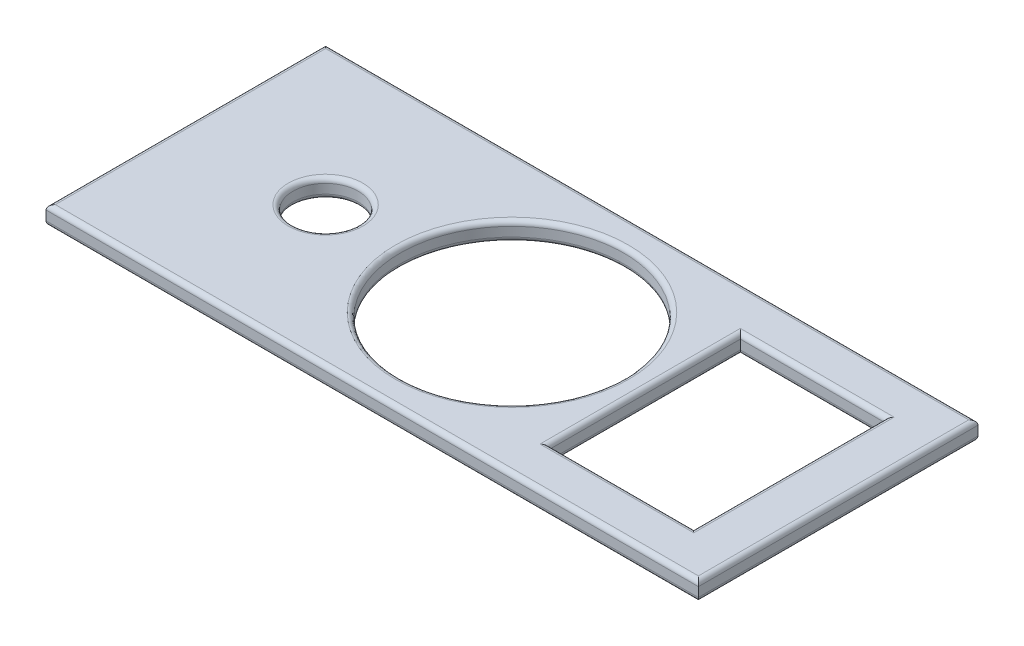
ISO-10303-21;
HEADER;
FILE_DESCRIPTION(('STEP AP214'),'2;1');
FILE_NAME('part.step','',(''),(''),'','','');
FILE_SCHEMA(('AUTOMOTIVE_DESIGN { 1 0 10303 214 1 1 1 1 }'));
ENDSEC;
DATA;
#1=APPLICATION_CONTEXT('core data for automotive mechanical design processes');
#2=APPLICATION_PROTOCOL_DEFINITION('international standard','automotive_design',2000,#1);
#3=PRODUCT_CONTEXT('',#1,'mechanical');
#4=PRODUCT('Part','Part','',(#3));
#5=PRODUCT_RELATED_PRODUCT_CATEGORY('part','',(#4));
#6=PRODUCT_DEFINITION_FORMATION('','',#4);
#7=PRODUCT_DEFINITION_CONTEXT('part definition',#1,'design');
#8=PRODUCT_DEFINITION('design','',#6,#7);
#9=PRODUCT_DEFINITION_SHAPE('','',#8);
#10=(LENGTH_UNIT() NAMED_UNIT(*) SI_UNIT(.MILLI.,.METRE.));
#11=(NAMED_UNIT(*) PLANE_ANGLE_UNIT() SI_UNIT($,.RADIAN.));
#12=(NAMED_UNIT(*) SI_UNIT($,.STERADIAN.) SOLID_ANGLE_UNIT());
#13=UNCERTAINTY_MEASURE_WITH_UNIT(LENGTH_MEASURE(1.E-05),#10,'distance_accuracy_value','');
#14=(GEOMETRIC_REPRESENTATION_CONTEXT(3) GLOBAL_UNCERTAINTY_ASSIGNED_CONTEXT((#13)) GLOBAL_UNIT_ASSIGNED_CONTEXT((#10,
#11,#12)) REPRESENTATION_CONTEXT('',''));
#15=CARTESIAN_POINT('',(0.,0.,0.));
#16=DIRECTION('',(0.,0.,1.));
#17=DIRECTION('',(1.,0.,0.));
#18=AXIS2_PLACEMENT_3D('',#15,#16,#17);
#19=CARTESIAN_POINT('',(0.,2.,0.));
#20=DIRECTION('',(0.,1.,0.));
#21=DIRECTION('',(0.,0.,1.));
#22=AXIS2_PLACEMENT_3D('',#19,#20,#21);
#23=PLANE('',#22);
#24=DIRECTION('',(-1.,0.,0.));
#25=VECTOR('',#24,1.);
#26=CARTESIAN_POINT('',(0.,2.,-10.75));
#27=LINE('',#26,#25);
#28=CARTESIAN_POINT('',(13.75,2.,-10.75));
#29=VERTEX_POINT('',#28);
#30=CARTESIAN_POINT('',(30.25,2.,-10.75));
#31=VERTEX_POINT('',#30);
#32=EDGE_CURVE('E48',#29,#31,#27,.F.);
#33=ORIENTED_EDGE('',*,*,#32,.T.);
#34=DIRECTION('',(0.,0.,-1.));
#35=VECTOR('',#34,1.);
#36=CARTESIAN_POINT('',(30.25,2.,0.));
#37=LINE('',#36,#35);
#38=CARTESIAN_POINT('',(30.25,2.,10.75));
#39=VERTEX_POINT('',#38);
#40=EDGE_CURVE('E11',#31,#39,#37,.F.);
#41=ORIENTED_EDGE('',*,*,#40,.T.);
#42=DIRECTION('',(1.,0.,0.));
#43=VECTOR('',#42,1.);
#44=CARTESIAN_POINT('',(0.,2.,10.75));
#45=LINE('',#44,#43);
#46=CARTESIAN_POINT('',(13.75,2.,10.75));
#47=VERTEX_POINT('',#46);
#48=EDGE_CURVE('E255',#39,#47,#45,.F.);
#49=ORIENTED_EDGE('',*,*,#48,.T.);
#50=DIRECTION('',(0.,0.,1.));
#51=VECTOR('',#50,1.);
#52=CARTESIAN_POINT('',(13.75,2.,0.));
#53=LINE('',#52,#51);
#54=EDGE_CURVE('E56',#47,#29,#53,.F.);
#55=ORIENTED_EDGE('',*,*,#54,.T.);
#56=EDGE_LOOP('',(#33,#41,#49,#55));
#57=FACE_BOUND('',#56,.T.);
#58=CARTESIAN_POINT('',(-20.,2.,0.));
#59=DIRECTION('',(0.,1.,0.));
#60=DIRECTION('',(0.,0.,1.));
#61=AXIS2_PLACEMENT_3D('',#58,#59,#60);
#62=CIRCLE('',#61,4.);
#63=CARTESIAN_POINT('',(-20.,2.,4.00000000000001));
#64=VERTEX_POINT('',#63);
#65=EDGE_CURVE('E253',#64,#64,#62,.F.);
#66=ORIENTED_EDGE('',*,*,#65,.T.);
#67=EDGE_LOOP('',(#66));
#68=FACE_BOUND('',#67,.T.);
#69=DIRECTION('',(0.,0.,-1.));
#70=VECTOR('',#69,1.);
#71=CARTESIAN_POINT('',(34.5,2.,-15.));
#72=LINE('',#71,#70);
#73=CARTESIAN_POINT('',(34.5,2.,14.5));
#74=VERTEX_POINT('',#73);
#75=CARTESIAN_POINT('',(34.5,2.,-14.5));
#76=VERTEX_POINT('',#75);
#77=EDGE_CURVE('E247',#74,#76,#72,.T.);
#78=ORIENTED_EDGE('',*,*,#77,.T.);
#79=DIRECTION('',(-1.,0.,0.));
#80=VECTOR('',#79,1.);
#81=CARTESIAN_POINT('',(-35.,2.,-14.5));
#82=LINE('',#81,#80);
#83=CARTESIAN_POINT('',(-34.5,2.,-14.5));
#84=VERTEX_POINT('',#83);
#85=EDGE_CURVE('E249',#76,#84,#82,.T.);
#86=ORIENTED_EDGE('',*,*,#85,.T.);
#87=DIRECTION('',(0.,0.,1.));
#88=VECTOR('',#87,1.);
#89=CARTESIAN_POINT('',(-34.5,2.,15.));
#90=LINE('',#89,#88);
#91=CARTESIAN_POINT('',(-34.5,2.,14.5));
#92=VERTEX_POINT('',#91);
#93=EDGE_CURVE('E245',#84,#92,#90,.T.);
#94=ORIENTED_EDGE('',*,*,#93,.T.);
#95=DIRECTION('',(1.,0.,0.));
#96=VECTOR('',#95,1.);
#97=CARTESIAN_POINT('',(35.,2.,14.5));
#98=LINE('',#97,#96);
#99=EDGE_CURVE('E243',#92,#74,#98,.T.);
#100=ORIENTED_EDGE('',*,*,#99,.T.);
#101=EDGE_LOOP('',(#78,#86,#94,#100));
#102=FACE_BOUND('',#101,.T.);
#103=CARTESIAN_POINT('',(0.,2.,0.));
#104=DIRECTION('',(0.,1.,0.));
#105=DIRECTION('',(0.,0.,1.));
#106=AXIS2_PLACEMENT_3D('',#103,#104,#105);
#107=CIRCLE('',#106,12.5);
#108=CARTESIAN_POINT('',(0.,2.,12.5));
#109=VERTEX_POINT('',#108);
#110=EDGE_CURVE('E239',#109,#109,#107,.F.);
#111=ORIENTED_EDGE('',*,*,#110,.T.);
#112=EDGE_LOOP('',(#111));
#113=FACE_BOUND('',#112,.T.);
#114=ADVANCED_FACE('F39',(#57,#68,#102,#113),#23,.T.);
#115=CARTESIAN_POINT('',(0.,0.,0.));
#116=DIRECTION('',(0.,1.,0.));
#117=DIRECTION('',(0.,0.,1.));
#118=AXIS2_PLACEMENT_3D('',#115,#116,#117);
#119=PLANE('',#118);
#120=DIRECTION('',(0.,0.,-1.));
#121=VECTOR('',#120,1.);
#122=CARTESIAN_POINT('',(30.25,0.,-10.25));
#123=LINE('',#122,#121);
#124=CARTESIAN_POINT('',(30.25,0.,10.75));
#125=VERTEX_POINT('',#124);
#126=CARTESIAN_POINT('',(30.25,0.,-10.75));
#127=VERTEX_POINT('',#126);
#128=EDGE_CURVE('E187',#125,#127,#123,.T.);
#129=ORIENTED_EDGE('',*,*,#128,.T.);
#130=DIRECTION('',(-1.,0.,0.));
#131=VECTOR('',#130,1.);
#132=CARTESIAN_POINT('',(14.25,0.,-10.75));
#133=LINE('',#132,#131);
#134=CARTESIAN_POINT('',(13.75,0.,-10.75));
#135=VERTEX_POINT('',#134);
#136=EDGE_CURVE('E189',#127,#135,#133,.T.);
#137=ORIENTED_EDGE('',*,*,#136,.T.);
#138=DIRECTION('',(0.,0.,1.));
#139=VECTOR('',#138,1.);
#140=CARTESIAN_POINT('',(13.75,0.,10.25));
#141=LINE('',#140,#139);
#142=CARTESIAN_POINT('',(13.75,0.,10.75));
#143=VERTEX_POINT('',#142);
#144=EDGE_CURVE('E178',#135,#143,#141,.T.);
#145=ORIENTED_EDGE('',*,*,#144,.T.);
#146=DIRECTION('',(1.,0.,0.));
#147=VECTOR('',#146,1.);
#148=CARTESIAN_POINT('',(29.75,0.,10.75));
#149=LINE('',#148,#147);
#150=EDGE_CURVE('E185',#143,#125,#149,.T.);
#151=ORIENTED_EDGE('',*,*,#150,.T.);
#152=EDGE_LOOP('',(#129,#137,#145,#151));
#153=FACE_BOUND('',#152,.T.);
#154=DIRECTION('',(0.,0.,-1.));
#155=VECTOR('',#154,1.);
#156=CARTESIAN_POINT('',(34.5,0.,0.));
#157=LINE('',#156,#155);
#158=CARTESIAN_POINT('',(34.5,0.,-14.5));
#159=VERTEX_POINT('',#158);
#160=CARTESIAN_POINT('',(34.5,0.,14.5));
#161=VERTEX_POINT('',#160);
#162=EDGE_CURVE('E176',#159,#161,#157,.F.);
#163=ORIENTED_EDGE('',*,*,#162,.T.);
#164=DIRECTION('',(1.,0.,0.));
#165=VECTOR('',#164,1.);
#166=CARTESIAN_POINT('',(0.,0.,14.5));
#167=LINE('',#166,#165);
#168=CARTESIAN_POINT('',(-34.5,0.,14.5));
#169=VERTEX_POINT('',#168);
#170=EDGE_CURVE('E160',#161,#169,#167,.F.);
#171=ORIENTED_EDGE('',*,*,#170,.T.);
#172=DIRECTION('',(0.,0.,1.));
#173=VECTOR('',#172,1.);
#174=CARTESIAN_POINT('',(-34.5,0.,0.));
#175=LINE('',#174,#173);
#176=CARTESIAN_POINT('',(-34.5,0.,-14.5));
#177=VERTEX_POINT('',#176);
#178=EDGE_CURVE('E170',#169,#177,#175,.F.);
#179=ORIENTED_EDGE('',*,*,#178,.T.);
#180=DIRECTION('',(-1.,0.,0.));
#181=VECTOR('',#180,1.);
#182=CARTESIAN_POINT('',(0.,0.,-14.5));
#183=LINE('',#182,#181);
#184=EDGE_CURVE('E172',#177,#159,#183,.F.);
#185=ORIENTED_EDGE('',*,*,#184,.T.);
#186=EDGE_LOOP('',(#163,#171,#179,#185));
#187=FACE_BOUND('',#186,.T.);
#188=CARTESIAN_POINT('',(0.,0.,0.));
#189=DIRECTION('',(0.,1.,0.));
#190=DIRECTION('',(0.,0.,1.));
#191=AXIS2_PLACEMENT_3D('',#188,#189,#190);
#192=CIRCLE('',#191,12.5);
#193=CARTESIAN_POINT('',(0.,0.,12.5));
#194=VERTEX_POINT('',#193);
#195=EDGE_CURVE('E173',#194,#194,#192,.T.);
#196=ORIENTED_EDGE('',*,*,#195,.T.);
#197=EDGE_LOOP('',(#196));
#198=FACE_BOUND('',#197,.T.);
#199=CARTESIAN_POINT('',(-20.,0.,0.));
#200=DIRECTION('',(0.,1.,0.));
#201=DIRECTION('',(0.,0.,1.));
#202=AXIS2_PLACEMENT_3D('',#199,#200,#201);
#203=CIRCLE('',#202,4.);
#204=CARTESIAN_POINT('',(-20.,0.,4.00000000000001));
#205=VERTEX_POINT('',#204);
#206=EDGE_CURVE('E312',#205,#205,#203,.T.);
#207=ORIENTED_EDGE('',*,*,#206,.T.);
#208=EDGE_LOOP('',(#207));
#209=FACE_BOUND('',#208,.T.);
#210=ADVANCED_FACE('F177',(#153,#187,#198,#209),#119,.F.);
#211=CARTESIAN_POINT('',(-35.,2.,15.));
#212=DIRECTION('',(1.,0.,0.));
#213=DIRECTION('',(0.,0.,-1.));
#214=AXIS2_PLACEMENT_3D('',#211,#212,#213);
#215=PLANE('',#214);
#216=DIRECTION('',(0.,-1.,0.));
#217=VECTOR('',#216,1.);
#218=CARTESIAN_POINT('',(-35.,2.,-15.));
#219=LINE('',#218,#217);
#220=CARTESIAN_POINT('',(-35.,1.5,-15.));
#221=VERTEX_POINT('',#220);
#222=CARTESIAN_POINT('',(-35.,0.5,-15.));
#223=VERTEX_POINT('',#222);
#224=EDGE_CURVE('E336',#221,#223,#219,.T.);
#225=ORIENTED_EDGE('',*,*,#224,.T.);
#226=DIRECTION('',(0.,0.,1.));
#227=VECTOR('',#226,1.);
#228=CARTESIAN_POINT('',(-35.,0.5,15.));
#229=LINE('',#228,#227);
#230=CARTESIAN_POINT('',(-35.,0.5,15.));
#231=VERTEX_POINT('',#230);
#232=EDGE_CURVE('E223',#223,#231,#229,.T.);
#233=ORIENTED_EDGE('',*,*,#232,.T.);
#234=DIRECTION('',(0.,-1.,0.));
#235=VECTOR('',#234,1.);
#236=CARTESIAN_POINT('',(-35.,2.,15.));
#237=LINE('',#236,#235);
#238=CARTESIAN_POINT('',(-35.,1.5,15.));
#239=VERTEX_POINT('',#238);
#240=EDGE_CURVE('E306',#239,#231,#237,.T.);
#241=ORIENTED_EDGE('',*,*,#240,.F.);
#242=DIRECTION('',(0.,0.,1.));
#243=VECTOR('',#242,1.);
#244=CARTESIAN_POINT('',(-35.,1.5,-15.));
#245=LINE('',#244,#243);
#246=EDGE_CURVE('E224',#239,#221,#245,.F.);
#247=ORIENTED_EDGE('',*,*,#246,.T.);
#248=EDGE_LOOP('',(#225,#233,#241,#247));
#249=FACE_BOUND('',#248,.T.);
#250=ADVANCED_FACE('F311',(#249),#215,.F.);
#251=CARTESIAN_POINT('',(35.,2.,15.));
#252=DIRECTION('',(0.,0.,-1.));
#253=DIRECTION('',(-1.,0.,0.));
#254=AXIS2_PLACEMENT_3D('',#251,#252,#253);
#255=PLANE('',#254);
#256=ORIENTED_EDGE('',*,*,#240,.T.);
#257=DIRECTION('',(1.,0.,0.));
#258=VECTOR('',#257,1.);
#259=CARTESIAN_POINT('',(35.,0.5,15.));
#260=LINE('',#259,#258);
#261=CARTESIAN_POINT('',(35.,0.5,15.));
#262=VERTEX_POINT('',#261);
#263=EDGE_CURVE('E159',#231,#262,#260,.T.);
#264=ORIENTED_EDGE('',*,*,#263,.T.);
#265=DIRECTION('',(0.,-1.,0.));
#266=VECTOR('',#265,1.);
#267=CARTESIAN_POINT('',(35.,2.,15.));
#268=LINE('',#267,#266);
#269=CARTESIAN_POINT('',(35.,1.5,15.));
#270=VERTEX_POINT('',#269);
#271=EDGE_CURVE('E309',#270,#262,#268,.T.);
#272=ORIENTED_EDGE('',*,*,#271,.F.);
#273=DIRECTION('',(1.,0.,0.));
#274=VECTOR('',#273,1.);
#275=CARTESIAN_POINT('',(-35.,1.5,15.));
#276=LINE('',#275,#274);
#277=EDGE_CURVE('E211',#270,#239,#276,.F.);
#278=ORIENTED_EDGE('',*,*,#277,.T.);
#279=EDGE_LOOP('',(#256,#264,#272,#278));
#280=FACE_BOUND('',#279,.T.);
#281=ADVANCED_FACE('F307',(#280),#255,.F.);
#282=CARTESIAN_POINT('',(35.,2.,15.));
#283=DIRECTION('',(-1.,0.,0.));
#284=DIRECTION('',(0.,0.,1.));
#285=AXIS2_PLACEMENT_3D('',#282,#283,#284);
#286=PLANE('',#285);
#287=ORIENTED_EDGE('',*,*,#271,.T.);
#288=DIRECTION('',(0.,0.,-1.));
#289=VECTOR('',#288,1.);
#290=CARTESIAN_POINT('',(35.,0.5,15.));
#291=LINE('',#290,#289);
#292=CARTESIAN_POINT('',(35.,0.5,-15.));
#293=VERTEX_POINT('',#292);
#294=EDGE_CURVE('E216',#262,#293,#291,.T.);
#295=ORIENTED_EDGE('',*,*,#294,.T.);
#296=DIRECTION('',(0.,-1.,0.));
#297=VECTOR('',#296,1.);
#298=CARTESIAN_POINT('',(35.,2.,-15.));
#299=LINE('',#298,#297);
#300=CARTESIAN_POINT('',(35.,1.5,-15.));
#301=VERTEX_POINT('',#300);
#302=EDGE_CURVE('E317',#301,#293,#299,.T.);
#303=ORIENTED_EDGE('',*,*,#302,.F.);
#304=DIRECTION('',(0.,0.,-1.));
#305=VECTOR('',#304,1.);
#306=CARTESIAN_POINT('',(35.,1.5,15.));
#307=LINE('',#306,#305);
#308=EDGE_CURVE('E212',#301,#270,#307,.F.);
#309=ORIENTED_EDGE('',*,*,#308,.T.);
#310=EDGE_LOOP('',(#287,#295,#303,#309));
#311=FACE_BOUND('',#310,.T.);
#312=ADVANCED_FACE('F331',(#311),#286,.F.);
#313=CARTESIAN_POINT('',(35.,2.,-15.));
#314=DIRECTION('',(0.,0.,1.));
#315=DIRECTION('',(1.,0.,0.));
#316=AXIS2_PLACEMENT_3D('',#313,#314,#315);
#317=PLANE('',#316);
#318=ORIENTED_EDGE('',*,*,#302,.T.);
#319=DIRECTION('',(-1.,0.,0.));
#320=VECTOR('',#319,1.);
#321=CARTESIAN_POINT('',(35.,0.5,-15.));
#322=LINE('',#321,#320);
#323=EDGE_CURVE('E222',#293,#223,#322,.T.);
#324=ORIENTED_EDGE('',*,*,#323,.T.);
#325=ORIENTED_EDGE('',*,*,#224,.F.);
#326=DIRECTION('',(-1.,0.,0.));
#327=VECTOR('',#326,1.);
#328=CARTESIAN_POINT('',(35.,1.5,-15.));
#329=LINE('',#328,#327);
#330=EDGE_CURVE('E217',#221,#301,#329,.F.);
#331=ORIENTED_EDGE('',*,*,#330,.T.);
#332=EDGE_LOOP('',(#318,#324,#325,#331));
#333=FACE_BOUND('',#332,.T.);
#334=ADVANCED_FACE('F403',(#333),#317,.F.);
#335=CARTESIAN_POINT('',(0.,2.,0.));
#336=DIRECTION('',(0.,-1.,0.));
#337=DIRECTION('',(0.,0.,-1.));
#338=AXIS2_PLACEMENT_3D('',#335,#336,#337);
#339=CYLINDRICAL_SURFACE('',#338,12.);
#340=CARTESIAN_POINT('',(0.,0.5,0.));
#341=DIRECTION('',(0.,1.,0.));
#342=DIRECTION('',(0.,0.,1.));
#343=AXIS2_PLACEMENT_3D('',#340,#341,#342);
#344=CIRCLE('',#343,12.);
#345=CARTESIAN_POINT('',(0.,0.5,12.));
#346=VERTEX_POINT('',#345);
#347=EDGE_CURVE('E229',#346,#346,#344,.F.);
#348=ORIENTED_EDGE('',*,*,#347,.T.);
#349=EDGE_LOOP('',(#348));
#350=FACE_BOUND('',#349,.T.);
#351=CARTESIAN_POINT('',(0.,1.5,0.));
#352=DIRECTION('',(0.,1.,0.));
#353=DIRECTION('',(0.,0.,1.));
#354=AXIS2_PLACEMENT_3D('',#351,#352,#353);
#355=CIRCLE('',#354,12.);
#356=CARTESIAN_POINT('',(0.,1.5,12.));
#357=VERTEX_POINT('',#356);
#358=EDGE_CURVE('E230',#357,#357,#355,.T.);
#359=ORIENTED_EDGE('',*,*,#358,.T.);
#360=EDGE_LOOP('',(#359));
#361=FACE_BOUND('',#360,.T.);
#362=ADVANCED_FACE('F405',(#350,#361),#339,.F.);
#363=CARTESIAN_POINT('',(-20.,2.,0.));
#364=DIRECTION('',(0.,-1.,0.));
#365=DIRECTION('',(0.,0.,-1.));
#366=AXIS2_PLACEMENT_3D('',#363,#364,#365);
#367=CYLINDRICAL_SURFACE('',#366,3.5);
#368=CARTESIAN_POINT('',(-20.,0.5,0.));
#369=DIRECTION('',(0.,1.,0.));
#370=DIRECTION('',(0.,0.,1.));
#371=AXIS2_PLACEMENT_3D('',#368,#369,#370);
#372=CIRCLE('',#371,3.5);
#373=CARTESIAN_POINT('',(-20.,0.5,3.50000000000001));
#374=VERTEX_POINT('',#373);
#375=EDGE_CURVE('E237',#374,#374,#372,.F.);
#376=ORIENTED_EDGE('',*,*,#375,.T.);
#377=EDGE_LOOP('',(#376));
#378=FACE_BOUND('',#377,.T.);
#379=CARTESIAN_POINT('',(-20.,1.5,0.));
#380=DIRECTION('',(0.,1.,0.));
#381=DIRECTION('',(0.,0.,1.));
#382=AXIS2_PLACEMENT_3D('',#379,#380,#381);
#383=CIRCLE('',#382,3.5);
#384=CARTESIAN_POINT('',(-20.,1.5,3.50000000000001));
#385=VERTEX_POINT('',#384);
#386=EDGE_CURVE('E234',#385,#385,#383,.T.);
#387=ORIENTED_EDGE('',*,*,#386,.T.);
#388=EDGE_LOOP('',(#387));
#389=FACE_BOUND('',#388,.T.);
#390=ADVANCED_FACE('F610',(#378,#389),#367,.F.);
#391=CARTESIAN_POINT('',(14.25,2.,10.25));
#392=DIRECTION('',(1.,0.,0.));
#393=DIRECTION('',(0.,0.,-1.));
#394=AXIS2_PLACEMENT_3D('',#391,#392,#393);
#395=PLANE('',#394);
#396=DIRECTION('',(0.,-1.,0.));
#397=VECTOR('',#396,1.);
#398=CARTESIAN_POINT('',(14.25,2.,10.25));
#399=LINE('',#398,#397);
#400=CARTESIAN_POINT('',(14.25,1.5,10.25));
#401=VERTEX_POINT('',#400);
#402=CARTESIAN_POINT('',(14.25,0.5,10.25));
#403=VERTEX_POINT('',#402);
#404=EDGE_CURVE('E340',#401,#403,#399,.T.);
#405=ORIENTED_EDGE('',*,*,#404,.T.);
#406=DIRECTION('',(0.,0.,1.));
#407=VECTOR('',#406,1.);
#408=CARTESIAN_POINT('',(14.25,0.5,-10.25));
#409=LINE('',#408,#407);
#410=CARTESIAN_POINT('',(14.25,0.5,-10.25));
#411=VERTEX_POINT('',#410);
#412=EDGE_CURVE('E207',#403,#411,#409,.F.);
#413=ORIENTED_EDGE('',*,*,#412,.T.);
#414=DIRECTION('',(0.,-1.,0.));
#415=VECTOR('',#414,1.);
#416=CARTESIAN_POINT('',(14.25,2.,-10.25));
#417=LINE('',#416,#415);
#418=CARTESIAN_POINT('',(14.25,1.5,-10.25));
#419=VERTEX_POINT('',#418);
#420=EDGE_CURVE('E268',#419,#411,#417,.T.);
#421=ORIENTED_EDGE('',*,*,#420,.F.);
#422=DIRECTION('',(0.,0.,1.));
#423=VECTOR('',#422,1.);
#424=CARTESIAN_POINT('',(14.25,1.5,10.25));
#425=LINE('',#424,#423);
#426=EDGE_CURVE('E210',#419,#401,#425,.T.);
#427=ORIENTED_EDGE('',*,*,#426,.T.);
#428=EDGE_LOOP('',(#405,#413,#421,#427));
#429=FACE_BOUND('',#428,.T.);
#430=ADVANCED_FACE('F597',(#429),#395,.T.);
#431=CARTESIAN_POINT('',(29.75,2.,10.25));
#432=DIRECTION('',(0.,0.,-1.));
#433=DIRECTION('',(-1.,0.,0.));
#434=AXIS2_PLACEMENT_3D('',#431,#432,#433);
#435=PLANE('',#434);
#436=DIRECTION('',(0.,-1.,0.));
#437=VECTOR('',#436,1.);
#438=CARTESIAN_POINT('',(29.75,2.,10.25));
#439=LINE('',#438,#437);
#440=CARTESIAN_POINT('',(29.75,1.5,10.25));
#441=VERTEX_POINT('',#440);
#442=CARTESIAN_POINT('',(29.75,0.5,10.25));
#443=VERTEX_POINT('',#442);
#444=EDGE_CURVE('E345',#441,#443,#439,.T.);
#445=ORIENTED_EDGE('',*,*,#444,.T.);
#446=DIRECTION('',(1.,0.,0.));
#447=VECTOR('',#446,1.);
#448=CARTESIAN_POINT('',(14.25,0.5,10.25));
#449=LINE('',#448,#447);
#450=EDGE_CURVE('E202',#443,#403,#449,.F.);
#451=ORIENTED_EDGE('',*,*,#450,.T.);
#452=ORIENTED_EDGE('',*,*,#404,.F.);
#453=DIRECTION('',(1.,0.,0.));
#454=VECTOR('',#453,1.);
#455=CARTESIAN_POINT('',(29.75,1.5,10.25));
#456=LINE('',#455,#454);
#457=EDGE_CURVE('E201',#401,#441,#456,.T.);
#458=ORIENTED_EDGE('',*,*,#457,.T.);
#459=EDGE_LOOP('',(#445,#451,#452,#458));
#460=FACE_BOUND('',#459,.T.);
#461=ADVANCED_FACE('F379',(#460),#435,.T.);
#462=CARTESIAN_POINT('',(29.75,2.,10.25));
#463=DIRECTION('',(-1.,0.,0.));
#464=DIRECTION('',(0.,0.,1.));
#465=AXIS2_PLACEMENT_3D('',#462,#463,#464);
#466=PLANE('',#465);
#467=DIRECTION('',(0.,-1.,0.));
#468=VECTOR('',#467,1.);
#469=CARTESIAN_POINT('',(29.75,2.,-10.25));
#470=LINE('',#469,#468);
#471=CARTESIAN_POINT('',(29.75,1.5,-10.25));
#472=VERTEX_POINT('',#471);
#473=CARTESIAN_POINT('',(29.75,0.5,-10.25));
#474=VERTEX_POINT('',#473);
#475=EDGE_CURVE('E343',#472,#474,#470,.T.);
#476=ORIENTED_EDGE('',*,*,#475,.T.);
#477=DIRECTION('',(0.,0.,-1.));
#478=VECTOR('',#477,1.);
#479=CARTESIAN_POINT('',(29.75,0.5,10.25));
#480=LINE('',#479,#478);
#481=EDGE_CURVE('E203',#474,#443,#480,.F.);
#482=ORIENTED_EDGE('',*,*,#481,.T.);
#483=ORIENTED_EDGE('',*,*,#444,.F.);
#484=DIRECTION('',(0.,0.,-1.));
#485=VECTOR('',#484,1.);
#486=CARTESIAN_POINT('',(29.75,1.5,10.25));
#487=LINE('',#486,#485);
#488=EDGE_CURVE('E196',#441,#472,#487,.T.);
#489=ORIENTED_EDGE('',*,*,#488,.T.);
#490=EDGE_LOOP('',(#476,#482,#483,#489));
#491=FACE_BOUND('',#490,.T.);
#492=ADVANCED_FACE('F376',(#491),#466,.T.);
#493=CARTESIAN_POINT('',(29.75,2.,-10.25));
#494=DIRECTION('',(0.,0.,1.));
#495=DIRECTION('',(1.,0.,0.));
#496=AXIS2_PLACEMENT_3D('',#493,#494,#495);
#497=PLANE('',#496);
#498=ORIENTED_EDGE('',*,*,#420,.T.);
#499=DIRECTION('',(-1.,0.,0.));
#500=VECTOR('',#499,1.);
#501=CARTESIAN_POINT('',(29.75,0.5,-10.25));
#502=LINE('',#501,#500);
#503=EDGE_CURVE('E193',#411,#474,#502,.F.);
#504=ORIENTED_EDGE('',*,*,#503,.T.);
#505=ORIENTED_EDGE('',*,*,#475,.F.);
#506=DIRECTION('',(-1.,0.,0.));
#507=VECTOR('',#506,1.);
#508=CARTESIAN_POINT('',(29.75,1.5,-10.25));
#509=LINE('',#508,#507);
#510=EDGE_CURVE('E194',#472,#419,#509,.T.);
#511=ORIENTED_EDGE('',*,*,#510,.T.);
#512=EDGE_LOOP('',(#498,#504,#505,#511));
#513=FACE_BOUND('',#512,.T.);
#514=ADVANCED_FACE('F355',(#513),#497,.T.);
#515=CARTESIAN_POINT('',(0.,0.5,10.75));
#516=DIRECTION('',(-1.,0.,0.));
#517=DIRECTION('',(0.,0.,1.));
#518=AXIS2_PLACEMENT_3D('',#515,#516,#517);
#519=CYLINDRICAL_SURFACE('',#518,0.5);
#520=CARTESIAN_POINT('',(13.75,0.5,10.75));
#521=DIRECTION('',(-0.707106781186548,0.,-0.707106781186547));
#522=DIRECTION('',(-0.707106781186547,0.,0.707106781186548));
#523=AXIS2_PLACEMENT_3D('',#520,#521,#522);
#524=ELLIPSE('',#523,0.707106781186547,0.5);
#525=EDGE_CURVE('E265',#403,#143,#524,.T.);
#526=ORIENTED_EDGE('',*,*,#525,.F.);
#527=ORIENTED_EDGE('',*,*,#450,.F.);
#528=CARTESIAN_POINT('',(30.25,0.5,10.75));
#529=DIRECTION('',(-0.707106781186547,0.,0.707106781186548));
#530=DIRECTION('',(0.707106781186548,0.,0.707106781186547));
#531=AXIS2_PLACEMENT_3D('',#528,#529,#530);
#532=ELLIPSE('',#531,0.707106781186547,0.5);
#533=EDGE_CURVE('E264',#125,#443,#532,.F.);
#534=ORIENTED_EDGE('',*,*,#533,.F.);
#535=ORIENTED_EDGE('',*,*,#150,.F.);
#536=EDGE_LOOP('',(#526,#527,#534,#535));
#537=FACE_BOUND('',#536,.T.);
#538=ADVANCED_FACE('F383',(#537),#519,.T.);
#539=CARTESIAN_POINT('',(30.25,0.5,0.));
#540=DIRECTION('',(0.,0.,1.));
#541=DIRECTION('',(1.,0.,0.));
#542=AXIS2_PLACEMENT_3D('',#539,#540,#541);
#543=CYLINDRICAL_SURFACE('',#542,0.5);
#544=ORIENTED_EDGE('',*,*,#533,.T.);
#545=ORIENTED_EDGE('',*,*,#481,.F.);
#546=CARTESIAN_POINT('',(30.25,0.5,-10.75));
#547=DIRECTION('',(0.707106781186548,0.,0.707106781186547));
#548=DIRECTION('',(0.707106781186547,0.,-0.707106781186548));
#549=AXIS2_PLACEMENT_3D('',#546,#547,#548);
#550=ELLIPSE('',#549,0.707106781186548,0.5);
#551=EDGE_CURVE('E257',#127,#474,#550,.F.);
#552=ORIENTED_EDGE('',*,*,#551,.F.);
#553=ORIENTED_EDGE('',*,*,#128,.F.);
#554=EDGE_LOOP('',(#544,#545,#552,#553));
#555=FACE_BOUND('',#554,.T.);
#556=ADVANCED_FACE('F373',(#555),#543,.T.);
#557=CARTESIAN_POINT('',(13.75,0.5,0.));
#558=DIRECTION('',(0.,0.,-1.));
#559=DIRECTION('',(-1.,0.,0.));
#560=AXIS2_PLACEMENT_3D('',#557,#558,#559);
#561=CYLINDRICAL_SURFACE('',#560,0.5);
#562=ORIENTED_EDGE('',*,*,#525,.T.);
#563=ORIENTED_EDGE('',*,*,#144,.F.);
#564=CARTESIAN_POINT('',(13.75,0.5,-10.75));
#565=DIRECTION('',(0.707106781186547,0.,-0.707106781186548));
#566=DIRECTION('',(0.707106781186548,0.,0.707106781186547));
#567=AXIS2_PLACEMENT_3D('',#564,#565,#566);
#568=ELLIPSE('',#567,0.707106781186548,0.5);
#569=EDGE_CURVE('E256',#411,#135,#568,.T.);
#570=ORIENTED_EDGE('',*,*,#569,.F.);
#571=ORIENTED_EDGE('',*,*,#412,.F.);
#572=EDGE_LOOP('',(#562,#563,#570,#571));
#573=FACE_BOUND('',#572,.T.);
#574=ADVANCED_FACE('F368',(#573),#561,.T.);
#575=CARTESIAN_POINT('',(0.,0.5,-10.75));
#576=DIRECTION('',(1.,0.,0.));
#577=DIRECTION('',(0.,0.,-1.));
#578=AXIS2_PLACEMENT_3D('',#575,#576,#577);
#579=CYLINDRICAL_SURFACE('',#578,0.5);
#580=ORIENTED_EDGE('',*,*,#551,.T.);
#581=ORIENTED_EDGE('',*,*,#503,.F.);
#582=ORIENTED_EDGE('',*,*,#569,.T.);
#583=ORIENTED_EDGE('',*,*,#136,.F.);
#584=EDGE_LOOP('',(#580,#581,#582,#583));
#585=FACE_BOUND('',#584,.T.);
#586=ADVANCED_FACE('F356',(#585),#579,.T.);
#587=CARTESIAN_POINT('',(35.,0.5,-14.5));
#588=DIRECTION('',(-1.,0.,0.));
#589=DIRECTION('',(0.,0.,1.));
#590=AXIS2_PLACEMENT_3D('',#587,#588,#589);
#591=CYLINDRICAL_SURFACE('',#590,0.5);
#592=CARTESIAN_POINT('',(34.5,0.5,-14.5));
#593=DIRECTION('',(-0.707106781186547,0.,-0.707106781186547));
#594=DIRECTION('',(-0.707106781186547,0.,0.707106781186547));
#595=AXIS2_PLACEMENT_3D('',#592,#593,#594);
#596=ELLIPSE('',#595,0.707106781186547,0.5);
#597=EDGE_CURVE('E162',#159,#293,#596,.F.);
#598=ORIENTED_EDGE('',*,*,#597,.F.);
#599=ORIENTED_EDGE('',*,*,#184,.F.);
#600=CARTESIAN_POINT('',(-34.5,0.5,-14.5));
#601=DIRECTION('',(-0.707106781186547,0.,0.707106781186547));
#602=DIRECTION('',(0.707106781186547,0.,0.707106781186547));
#603=AXIS2_PLACEMENT_3D('',#600,#601,#602);
#604=ELLIPSE('',#603,0.707106781186547,0.5);
#605=EDGE_CURVE('E168',#223,#177,#604,.T.);
#606=ORIENTED_EDGE('',*,*,#605,.F.);
#607=ORIENTED_EDGE('',*,*,#323,.F.);
#608=EDGE_LOOP('',(#598,#599,#606,#607));
#609=FACE_BOUND('',#608,.T.);
#610=ADVANCED_FACE('F330',(#609),#591,.T.);
#611=CARTESIAN_POINT('',(-34.5,0.5,15.));
#612=DIRECTION('',(0.,0.,1.));
#613=DIRECTION('',(1.,0.,0.));
#614=AXIS2_PLACEMENT_3D('',#611,#612,#613);
#615=CYLINDRICAL_SURFACE('',#614,0.5);
#616=ORIENTED_EDGE('',*,*,#605,.T.);
#617=ORIENTED_EDGE('',*,*,#178,.F.);
#618=CARTESIAN_POINT('',(-34.5,0.5,14.5));
#619=DIRECTION('',(0.707106781186547,0.,0.707106781186547));
#620=DIRECTION('',(-0.707106781186547,0.,0.707106781186547));
#621=AXIS2_PLACEMENT_3D('',#618,#619,#620);
#622=ELLIPSE('',#621,0.707106781186547,0.5);
#623=EDGE_CURVE('E153',#231,#169,#622,.T.);
#624=ORIENTED_EDGE('',*,*,#623,.F.);
#625=ORIENTED_EDGE('',*,*,#232,.F.);
#626=EDGE_LOOP('',(#616,#617,#624,#625));
#627=FACE_BOUND('',#626,.T.);
#628=ADVANCED_FACE('F169',(#627),#615,.T.);
#629=CARTESIAN_POINT('',(34.5,0.5,15.));
#630=DIRECTION('',(0.,0.,-1.));
#631=DIRECTION('',(-1.,0.,0.));
#632=AXIS2_PLACEMENT_3D('',#629,#630,#631);
#633=CYLINDRICAL_SURFACE('',#632,0.5);
#634=ORIENTED_EDGE('',*,*,#597,.T.);
#635=ORIENTED_EDGE('',*,*,#294,.F.);
#636=CARTESIAN_POINT('',(34.5,0.5,14.5));
#637=DIRECTION('',(0.707106781186547,0.,-0.707106781186547));
#638=DIRECTION('',(-0.707106781186547,0.,-0.707106781186547));
#639=AXIS2_PLACEMENT_3D('',#636,#637,#638);
#640=ELLIPSE('',#639,0.707106781186547,0.5);
#641=EDGE_CURVE('E163',#161,#262,#640,.F.);
#642=ORIENTED_EDGE('',*,*,#641,.F.);
#643=ORIENTED_EDGE('',*,*,#162,.F.);
#644=EDGE_LOOP('',(#634,#635,#642,#643));
#645=FACE_BOUND('',#644,.T.);
#646=ADVANCED_FACE('F329',(#645),#633,.T.);
#647=CARTESIAN_POINT('',(35.,0.5,14.5));
#648=DIRECTION('',(1.,0.,0.));
#649=DIRECTION('',(0.,0.,-1.));
#650=AXIS2_PLACEMENT_3D('',#647,#648,#649);
#651=CYLINDRICAL_SURFACE('',#650,0.5);
#652=ORIENTED_EDGE('',*,*,#623,.T.);
#653=ORIENTED_EDGE('',*,*,#170,.F.);
#654=ORIENTED_EDGE('',*,*,#641,.T.);
#655=ORIENTED_EDGE('',*,*,#263,.F.);
#656=EDGE_LOOP('',(#652,#653,#654,#655));
#657=FACE_BOUND('',#656,.T.);
#658=ADVANCED_FACE('F154',(#657),#651,.T.);
#659=CARTESIAN_POINT('',(0.,0.5,0.));
#660=DIRECTION('',(0.,1.,0.));
#661=DIRECTION('',(0.,0.,1.));
#662=AXIS2_PLACEMENT_3D('',#659,#660,#661);
#663=TOROIDAL_SURFACE('',#662,12.5,0.5);
#664=ORIENTED_EDGE('',*,*,#347,.F.);
#665=EDGE_LOOP('',(#664));
#666=FACE_BOUND('',#665,.T.);
#667=ORIENTED_EDGE('',*,*,#195,.F.);
#668=EDGE_LOOP('',(#667));
#669=FACE_BOUND('',#668,.T.);
#670=ADVANCED_FACE('F451',(#666,#669),#663,.T.);
#671=CARTESIAN_POINT('',(-20.,0.5,0.));
#672=DIRECTION('',(0.,1.,0.));
#673=DIRECTION('',(0.,0.,1.));
#674=AXIS2_PLACEMENT_3D('',#671,#672,#673);
#675=TOROIDAL_SURFACE('',#674,4.,0.5);
#676=ORIENTED_EDGE('',*,*,#375,.F.);
#677=EDGE_LOOP('',(#676));
#678=FACE_BOUND('',#677,.T.);
#679=ORIENTED_EDGE('',*,*,#206,.F.);
#680=EDGE_LOOP('',(#679));
#681=FACE_BOUND('',#680,.T.);
#682=ADVANCED_FACE('F461',(#678,#681),#675,.T.);
#683=CARTESIAN_POINT('',(13.75,1.5,10.25));
#684=DIRECTION('',(0.,0.,1.));
#685=DIRECTION('',(1.,0.,0.));
#686=AXIS2_PLACEMENT_3D('',#683,#684,#685);
#687=CYLINDRICAL_SURFACE('',#686,0.5);
#688=CARTESIAN_POINT('',(13.75,1.5,-10.75));
#689=DIRECTION('',(-0.707106781186547,0.,0.707106781186548));
#690=DIRECTION('',(-0.707106781186548,0.,-0.707106781186547));
#691=AXIS2_PLACEMENT_3D('',#688,#689,#690);
#692=ELLIPSE('',#691,0.707106781186548,0.5);
#693=EDGE_CURVE('E279',#29,#419,#692,.F.);
#694=ORIENTED_EDGE('',*,*,#693,.F.);
#695=ORIENTED_EDGE('',*,*,#54,.F.);
#696=CARTESIAN_POINT('',(13.75,1.5,10.75));
#697=DIRECTION('',(0.707106781186548,0.,0.707106781186547));
#698=DIRECTION('',(-0.707106781186547,0.,0.707106781186548));
#699=AXIS2_PLACEMENT_3D('',#696,#697,#698);
#700=ELLIPSE('',#699,0.707106781186547,0.5);
#701=EDGE_CURVE('E267',#401,#47,#700,.T.);
#702=ORIENTED_EDGE('',*,*,#701,.F.);
#703=ORIENTED_EDGE('',*,*,#426,.F.);
#704=EDGE_LOOP('',(#694,#695,#702,#703));
#705=FACE_BOUND('',#704,.T.);
#706=ADVANCED_FACE('F468',(#705),#687,.T.);
#707=CARTESIAN_POINT('',(29.75,1.5,10.75));
#708=DIRECTION('',(1.,0.,0.));
#709=DIRECTION('',(0.,0.,-1.));
#710=AXIS2_PLACEMENT_3D('',#707,#708,#709);
#711=CYLINDRICAL_SURFACE('',#710,0.5);
#712=ORIENTED_EDGE('',*,*,#701,.T.);
#713=ORIENTED_EDGE('',*,*,#48,.F.);
#714=CARTESIAN_POINT('',(30.25,1.5,10.75));
#715=DIRECTION('',(0.707106781186547,0.,-0.707106781186548));
#716=DIRECTION('',(-0.707106781186548,0.,-0.707106781186547));
#717=AXIS2_PLACEMENT_3D('',#714,#715,#716);
#718=ELLIPSE('',#717,0.707106781186547,0.5);
#719=EDGE_CURVE('E277',#441,#39,#718,.T.);
#720=ORIENTED_EDGE('',*,*,#719,.F.);
#721=ORIENTED_EDGE('',*,*,#457,.F.);
#722=EDGE_LOOP('',(#712,#713,#720,#721));
#723=FACE_BOUND('',#722,.T.);
#724=ADVANCED_FACE('F479',(#723),#711,.T.);
#725=CARTESIAN_POINT('',(29.75,1.5,-10.75));
#726=DIRECTION('',(-1.,0.,0.));
#727=DIRECTION('',(0.,0.,1.));
#728=AXIS2_PLACEMENT_3D('',#725,#726,#727);
#729=CYLINDRICAL_SURFACE('',#728,0.5);
#730=ORIENTED_EDGE('',*,*,#693,.T.);
#731=ORIENTED_EDGE('',*,*,#510,.F.);
#732=CARTESIAN_POINT('',(30.25,1.5,-10.75));
#733=DIRECTION('',(-0.707106781186548,0.,-0.707106781186547));
#734=DIRECTION('',(0.707106781186547,0.,-0.707106781186548));
#735=AXIS2_PLACEMENT_3D('',#732,#733,#734);
#736=ELLIPSE('',#735,0.707106781186548,0.5);
#737=EDGE_CURVE('E273',#31,#472,#736,.F.);
#738=ORIENTED_EDGE('',*,*,#737,.F.);
#739=ORIENTED_EDGE('',*,*,#32,.F.);
#740=EDGE_LOOP('',(#730,#731,#738,#739));
#741=FACE_BOUND('',#740,.T.);
#742=ADVANCED_FACE('F488',(#741),#729,.T.);
#743=CARTESIAN_POINT('',(30.25,1.5,10.25));
#744=DIRECTION('',(0.,0.,-1.));
#745=DIRECTION('',(-1.,0.,0.));
#746=AXIS2_PLACEMENT_3D('',#743,#744,#745);
#747=CYLINDRICAL_SURFACE('',#746,0.5);
#748=ORIENTED_EDGE('',*,*,#719,.T.);
#749=ORIENTED_EDGE('',*,*,#40,.F.);
#750=ORIENTED_EDGE('',*,*,#737,.T.);
#751=ORIENTED_EDGE('',*,*,#488,.F.);
#752=EDGE_LOOP('',(#748,#749,#750,#751));
#753=FACE_BOUND('',#752,.T.);
#754=ADVANCED_FACE('F500',(#753),#747,.T.);
#755=CARTESIAN_POINT('',(-20.,1.5,0.));
#756=DIRECTION('',(0.,1.,0.));
#757=DIRECTION('',(0.,0.,1.));
#758=AXIS2_PLACEMENT_3D('',#755,#756,#757);
#759=TOROIDAL_SURFACE('',#758,4.,0.5);
#760=ORIENTED_EDGE('',*,*,#65,.F.);
#761=EDGE_LOOP('',(#760));
#762=FACE_BOUND('',#761,.T.);
#763=ORIENTED_EDGE('',*,*,#386,.F.);
#764=EDGE_LOOP('',(#763));
#765=FACE_BOUND('',#764,.T.);
#766=ADVANCED_FACE('F507',(#762,#765),#759,.T.);
#767=CARTESIAN_POINT('',(0.,1.5,14.5));
#768=DIRECTION('',(-1.,0.,0.));
#769=DIRECTION('',(0.,0.,1.));
#770=AXIS2_PLACEMENT_3D('',#767,#768,#769);
#771=CYLINDRICAL_SURFACE('',#770,0.5);
#772=CARTESIAN_POINT('',(-34.5,1.5,14.5));
#773=DIRECTION('',(-0.707106781186547,0.,-0.707106781186547));
#774=DIRECTION('',(0.707106781186547,0.,-0.707106781186547));
#775=AXIS2_PLACEMENT_3D('',#772,#773,#774);
#776=ELLIPSE('',#775,0.707106781186547,0.5);
#777=EDGE_CURVE('E287',#239,#92,#776,.T.);
#778=ORIENTED_EDGE('',*,*,#777,.F.);
#779=ORIENTED_EDGE('',*,*,#277,.F.);
#780=CARTESIAN_POINT('',(34.5,1.5,14.5));
#781=DIRECTION('',(-0.707106781186547,0.,0.707106781186547));
#782=DIRECTION('',(-0.707106781186547,0.,-0.707106781186547));
#783=AXIS2_PLACEMENT_3D('',#780,#781,#782);
#784=ELLIPSE('',#783,0.707106781186547,0.5);
#785=EDGE_CURVE('E43',#74,#270,#784,.F.);
#786=ORIENTED_EDGE('',*,*,#785,.F.);
#787=ORIENTED_EDGE('',*,*,#99,.F.);
#788=EDGE_LOOP('',(#778,#779,#786,#787));
#789=FACE_BOUND('',#788,.T.);
#790=ADVANCED_FACE('F305',(#789),#771,.T.);
#791=CARTESIAN_POINT('',(34.5,1.5,0.));
#792=DIRECTION('',(0.,0.,1.));
#793=DIRECTION('',(1.,0.,0.));
#794=AXIS2_PLACEMENT_3D('',#791,#792,#793);
#795=CYLINDRICAL_SURFACE('',#794,0.5);
#796=ORIENTED_EDGE('',*,*,#785,.T.);
#797=ORIENTED_EDGE('',*,*,#308,.F.);
#798=CARTESIAN_POINT('',(34.5,1.5,-14.5));
#799=DIRECTION('',(0.707106781186547,0.,0.707106781186547));
#800=DIRECTION('',(-0.707106781186547,0.,0.707106781186547));
#801=AXIS2_PLACEMENT_3D('',#798,#799,#800);
#802=ELLIPSE('',#801,0.707106781186547,0.5);
#803=EDGE_CURVE('E284',#76,#301,#802,.F.);
#804=ORIENTED_EDGE('',*,*,#803,.F.);
#805=ORIENTED_EDGE('',*,*,#77,.F.);
#806=EDGE_LOOP('',(#796,#797,#804,#805));
#807=FACE_BOUND('',#806,.T.);
#808=ADVANCED_FACE('F300',(#807),#795,.T.);
#809=CARTESIAN_POINT('',(-34.5,1.5,0.));
#810=DIRECTION('',(0.,0.,-1.));
#811=DIRECTION('',(-1.,0.,0.));
#812=AXIS2_PLACEMENT_3D('',#809,#810,#811);
#813=CYLINDRICAL_SURFACE('',#812,0.5);
#814=ORIENTED_EDGE('',*,*,#777,.T.);
#815=ORIENTED_EDGE('',*,*,#93,.F.);
#816=CARTESIAN_POINT('',(-34.5,1.5,-14.5));
#817=DIRECTION('',(0.707106781186547,0.,-0.707106781186547));
#818=DIRECTION('',(-0.707106781186547,0.,-0.707106781186547));
#819=AXIS2_PLACEMENT_3D('',#816,#817,#818);
#820=ELLIPSE('',#819,0.707106781186547,0.5);
#821=EDGE_CURVE('E282',#221,#84,#820,.T.);
#822=ORIENTED_EDGE('',*,*,#821,.F.);
#823=ORIENTED_EDGE('',*,*,#246,.F.);
#824=EDGE_LOOP('',(#814,#815,#822,#823));
#825=FACE_BOUND('',#824,.T.);
#826=ADVANCED_FACE('F530',(#825),#813,.T.);
#827=CARTESIAN_POINT('',(0.,1.5,-14.5));
#828=DIRECTION('',(1.,0.,0.));
#829=DIRECTION('',(0.,0.,-1.));
#830=AXIS2_PLACEMENT_3D('',#827,#828,#829);
#831=CYLINDRICAL_SURFACE('',#830,0.5);
#832=ORIENTED_EDGE('',*,*,#803,.T.);
#833=ORIENTED_EDGE('',*,*,#330,.F.);
#834=ORIENTED_EDGE('',*,*,#821,.T.);
#835=ORIENTED_EDGE('',*,*,#85,.F.);
#836=EDGE_LOOP('',(#832,#833,#834,#835));
#837=FACE_BOUND('',#836,.T.);
#838=ADVANCED_FACE('F540',(#837),#831,.T.);
#839=CARTESIAN_POINT('',(0.,1.5,0.));
#840=DIRECTION('',(0.,1.,0.));
#841=DIRECTION('',(0.,0.,1.));
#842=AXIS2_PLACEMENT_3D('',#839,#840,#841);
#843=TOROIDAL_SURFACE('',#842,12.5,0.5);
#844=ORIENTED_EDGE('',*,*,#110,.F.);
#845=EDGE_LOOP('',(#844));
#846=FACE_BOUND('',#845,.T.);
#847=ORIENTED_EDGE('',*,*,#358,.F.);
#848=EDGE_LOOP('',(#847));
#849=FACE_BOUND('',#848,.T.);
#850=ADVANCED_FACE('F41',(#846,#849),#843,.T.);
#851=CLOSED_SHELL('',(#114,#210,#250,#281,#312,#334,#362,#390,#430,#461,#492,#514,#538,#556,
#574,#586,#610,#628,#646,#658,#670,#682,#706,#724,#742,#754,#766,#790,#808,#826,#838,#850));
#852=MANIFOLD_SOLID_BREP('B2',#851);
#853=ADVANCED_BREP_SHAPE_REPRESENTATION('',(#18,#852),#14);
#854=SHAPE_DEFINITION_REPRESENTATION(#9,#853);
ENDSEC;
END-ISO-10303-21;
